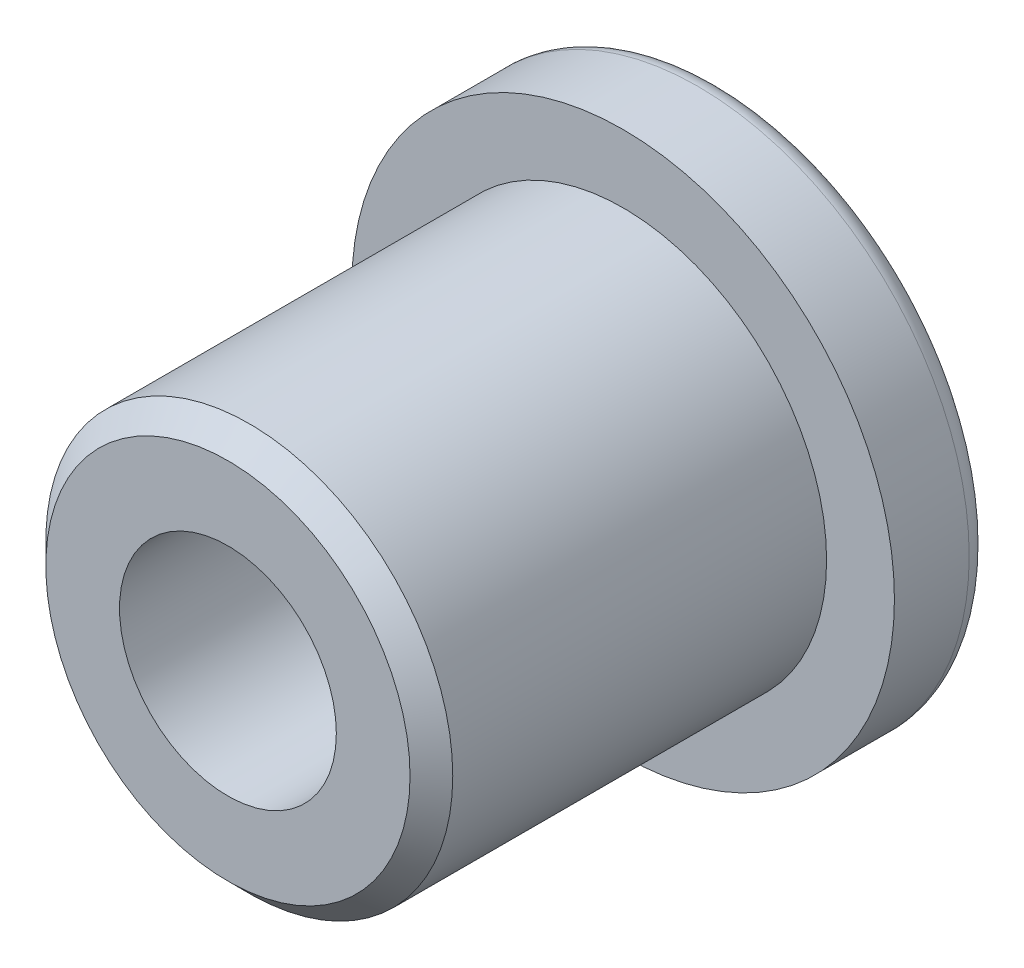
ISO-10303-21;
HEADER;
FILE_DESCRIPTION(('STEP AP214'),'2;1');
FILE_NAME('part.step','',(''),(''),'','','');
FILE_SCHEMA(('AUTOMOTIVE_DESIGN { 1 0 10303 214 1 1 1 1 }'));
ENDSEC;
DATA;
#1=APPLICATION_CONTEXT('core data for automotive mechanical design processes');
#2=APPLICATION_PROTOCOL_DEFINITION('international standard','automotive_design',2000,#1);
#3=PRODUCT_CONTEXT('',#1,'mechanical');
#4=PRODUCT('Part','Part','',(#3));
#5=PRODUCT_RELATED_PRODUCT_CATEGORY('part','',(#4));
#6=PRODUCT_DEFINITION_FORMATION('','',#4);
#7=PRODUCT_DEFINITION_CONTEXT('part definition',#1,'design');
#8=PRODUCT_DEFINITION('design','',#6,#7);
#9=PRODUCT_DEFINITION_SHAPE('','',#8);
#10=(LENGTH_UNIT() NAMED_UNIT(*) SI_UNIT(.MILLI.,.METRE.));
#11=(NAMED_UNIT(*) PLANE_ANGLE_UNIT() SI_UNIT($,.RADIAN.));
#12=(NAMED_UNIT(*) SI_UNIT($,.STERADIAN.) SOLID_ANGLE_UNIT());
#13=UNCERTAINTY_MEASURE_WITH_UNIT(LENGTH_MEASURE(1.E-05),#10,'distance_accuracy_value','');
#14=(GEOMETRIC_REPRESENTATION_CONTEXT(3) GLOBAL_UNCERTAINTY_ASSIGNED_CONTEXT((#13)) GLOBAL_UNIT_ASSIGNED_CONTEXT((#10,
#11,#12)) REPRESENTATION_CONTEXT('',''));
#15=CARTESIAN_POINT('',(0.,0.,0.));
#16=DIRECTION('',(0.,0.,1.));
#17=DIRECTION('',(1.,0.,0.));
#18=AXIS2_PLACEMENT_3D('',#15,#16,#17);
#19=CARTESIAN_POINT('',(0.,0.,3.));
#20=DIRECTION('',(0.,0.,-1.));
#21=DIRECTION('',(-1.,0.,0.));
#22=AXIS2_PLACEMENT_3D('',#19,#20,#21);
#23=CYLINDRICAL_SURFACE('',#22,3.75);
#24=CARTESIAN_POINT('',(0.,0.,10.8));
#25=DIRECTION('',(0.,0.,1.));
#26=DIRECTION('',(1.,0.,0.));
#27=AXIS2_PLACEMENT_3D('',#24,#25,#26);
#28=CIRCLE('',#27,3.75);
#29=CARTESIAN_POINT('',(3.75,0.,10.8));
#30=VERTEX_POINT('',#29);
#31=EDGE_CURVE('E55',#30,#30,#28,.T.);
#32=ORIENTED_EDGE('',*,*,#31,.T.);
#33=EDGE_LOOP('',(#32));
#34=FACE_BOUND('',#33,.T.);
#35=CARTESIAN_POINT('',(0.,0.,7.5));
#36=DIRECTION('',(0.,0.,-1.));
#37=DIRECTION('',(-1.,0.,0.));
#38=AXIS2_PLACEMENT_3D('',#35,#36,#37);
#39=CIRCLE('',#38,3.75);
#40=CARTESIAN_POINT('',(-3.75,0.,7.5));
#41=VERTEX_POINT('',#40);
#42=EDGE_CURVE('E52',#41,#41,#39,.T.);
#43=ORIENTED_EDGE('',*,*,#42,.T.);
#44=EDGE_LOOP('',(#43));
#45=FACE_BOUND('',#44,.T.);
#46=ADVANCED_FACE('F31',(#34,#45),#23,.F.);
#47=CARTESIAN_POINT('',(0.,0.,0.));
#48=DIRECTION('',(0.,0.,1.));
#49=DIRECTION('',(1.,0.,0.));
#50=AXIS2_PLACEMENT_3D('',#47,#48,#49);
#51=PLANE('',#50);
#52=CARTESIAN_POINT('',(0.,0.,0.));
#53=DIRECTION('',(0.,0.,1.));
#54=DIRECTION('',(1.,0.,0.));
#55=AXIS2_PLACEMENT_3D('',#52,#53,#54);
#56=CIRCLE('',#55,6.5);
#57=CARTESIAN_POINT('',(6.5,0.,0.));
#58=VERTEX_POINT('',#57);
#59=EDGE_CURVE('E10',#58,#58,#56,.T.);
#60=ORIENTED_EDGE('',*,*,#59,.T.);
#61=EDGE_LOOP('',(#60));
#62=FACE_BOUND('',#61,.T.);
#63=CARTESIAN_POINT('',(0.,0.,0.));
#64=DIRECTION('',(0.,0.,1.));
#65=DIRECTION('',(1.,0.,0.));
#66=AXIS2_PLACEMENT_3D('',#63,#64,#65);
#67=CIRCLE('',#66,11.7);
#68=CARTESIAN_POINT('',(11.7,0.,0.));
#69=VERTEX_POINT('',#68);
#70=EDGE_CURVE('E58',#69,#69,#67,.F.);
#71=ORIENTED_EDGE('',*,*,#70,.T.);
#72=EDGE_LOOP('',(#71));
#73=FACE_BOUND('',#72,.T.);
#74=ADVANCED_FACE('F100',(#62,#73),#51,.F.);
#75=CARTESIAN_POINT('',(0.,0.,3.));
#76=DIRECTION('',(0.,0.,-1.));
#77=DIRECTION('',(-1.,0.,0.));
#78=AXIS2_PLACEMENT_3D('',#75,#76,#77);
#79=CYLINDRICAL_SURFACE('',#78,12.7);
#80=CARTESIAN_POINT('',(0.,0.,1.));
#81=DIRECTION('',(0.,0.,1.));
#82=DIRECTION('',(1.,0.,0.));
#83=AXIS2_PLACEMENT_3D('',#80,#81,#82);
#84=CIRCLE('',#83,12.7);
#85=CARTESIAN_POINT('',(12.7,0.,1.));
#86=VERTEX_POINT('',#85);
#87=EDGE_CURVE('E61',#86,#86,#84,.T.);
#88=ORIENTED_EDGE('',*,*,#87,.T.);
#89=EDGE_LOOP('',(#88));
#90=FACE_BOUND('',#89,.T.);
#91=CARTESIAN_POINT('',(0.,0.,4.5));
#92=DIRECTION('',(0.,0.,1.));
#93=DIRECTION('',(1.,0.,0.));
#94=AXIS2_PLACEMENT_3D('',#91,#92,#93);
#95=CIRCLE('',#94,12.7);
#96=CARTESIAN_POINT('',(12.7,0.,4.5));
#97=VERTEX_POINT('',#96);
#98=EDGE_CURVE('E73',#97,#97,#95,.T.);
#99=ORIENTED_EDGE('',*,*,#98,.F.);
#100=EDGE_LOOP('',(#99));
#101=FACE_BOUND('',#100,.T.);
#102=ADVANCED_FACE('F105',(#90,#101),#79,.T.);
#103=CARTESIAN_POINT('',(0.,0.,23.));
#104=DIRECTION('',(0.,0.,1.));
#105=DIRECTION('',(1.,0.,0.));
#106=AXIS2_PLACEMENT_3D('',#103,#104,#105);
#107=PLANE('',#106);
#108=CARTESIAN_POINT('',(0.,0.,23.));
#109=DIRECTION('',(0.,0.,1.));
#110=DIRECTION('',(1.,0.,0.));
#111=AXIS2_PLACEMENT_3D('',#108,#109,#110);
#112=CIRCLE('',#111,8.525);
#113=CARTESIAN_POINT('',(8.525,0.,23.));
#114=VERTEX_POINT('',#113);
#115=EDGE_CURVE('E67',#114,#114,#112,.T.);
#116=ORIENTED_EDGE('',*,*,#115,.T.);
#117=EDGE_LOOP('',(#116));
#118=FACE_BOUND('',#117,.T.);
#119=CARTESIAN_POINT('',(0.,0.,23.));
#120=DIRECTION('',(0.,0.,1.));
#121=DIRECTION('',(1.,0.,0.));
#122=AXIS2_PLACEMENT_3D('',#119,#120,#121);
#123=CIRCLE('',#122,5.075);
#124=CARTESIAN_POINT('',(5.075,0.,23.));
#125=VERTEX_POINT('',#124);
#126=EDGE_CURVE('E70',#125,#125,#123,.T.);
#127=ORIENTED_EDGE('',*,*,#126,.F.);
#128=EDGE_LOOP('',(#127));
#129=FACE_BOUND('',#128,.T.);
#130=ADVANCED_FACE('F113',(#118,#129),#107,.T.);
#131=CARTESIAN_POINT('',(0.,0.,23.));
#132=DIRECTION('',(0.,0.,-1.));
#133=DIRECTION('',(-1.,0.,0.));
#134=AXIS2_PLACEMENT_3D('',#131,#132,#133);
#135=CYLINDRICAL_SURFACE('',#134,9.525);
#136=CARTESIAN_POINT('',(0.,0.,4.5));
#137=DIRECTION('',(0.,0.,1.));
#138=DIRECTION('',(1.,0.,0.));
#139=AXIS2_PLACEMENT_3D('',#136,#137,#138);
#140=CIRCLE('',#139,9.525);
#141=CARTESIAN_POINT('',(9.525,0.,4.5));
#142=VERTEX_POINT('',#141);
#143=EDGE_CURVE('E76',#142,#142,#140,.T.);
#144=ORIENTED_EDGE('',*,*,#143,.T.);
#145=EDGE_LOOP('',(#144));
#146=FACE_BOUND('',#145,.T.);
#147=CARTESIAN_POINT('',(0.,0.,22.));
#148=DIRECTION('',(0.,0.,1.));
#149=DIRECTION('',(1.,0.,0.));
#150=AXIS2_PLACEMENT_3D('',#147,#148,#149);
#151=CIRCLE('',#150,9.525);
#152=CARTESIAN_POINT('',(9.525,0.,22.));
#153=VERTEX_POINT('',#152);
#154=EDGE_CURVE('E64',#153,#153,#151,.F.);
#155=ORIENTED_EDGE('',*,*,#154,.T.);
#156=EDGE_LOOP('',(#155));
#157=FACE_BOUND('',#156,.T.);
#158=ADVANCED_FACE('F108',(#146,#157),#135,.T.);
#159=CARTESIAN_POINT('',(0.,0.,23.));
#160=DIRECTION('',(0.,0.,-1.));
#161=DIRECTION('',(-1.,0.,0.));
#162=AXIS2_PLACEMENT_3D('',#159,#160,#161);
#163=CYLINDRICAL_SURFACE('',#162,5.075);
#164=CARTESIAN_POINT('',(0.,0.,10.8));
#165=DIRECTION('',(0.,0.,1.));
#166=DIRECTION('',(1.,0.,0.));
#167=AXIS2_PLACEMENT_3D('',#164,#165,#166);
#168=CIRCLE('',#167,5.075);
#169=CARTESIAN_POINT('',(5.075,0.,10.8));
#170=VERTEX_POINT('',#169);
#171=EDGE_CURVE('E51',#170,#170,#168,.T.);
#172=ORIENTED_EDGE('',*,*,#171,.F.);
#173=EDGE_LOOP('',(#172));
#174=FACE_BOUND('',#173,.T.);
#175=ORIENTED_EDGE('',*,*,#126,.T.);
#176=EDGE_LOOP('',(#175));
#177=FACE_BOUND('',#176,.T.);
#178=ADVANCED_FACE('F118',(#174,#177),#163,.F.);
#179=CARTESIAN_POINT('',(0.,0.,23.));
#180=DIRECTION('',(0.,0.,-1.));
#181=DIRECTION('',(-1.,0.,0.));
#182=AXIS2_PLACEMENT_3D('',#179,#180,#181);
#183=CONICAL_SURFACE('',#182,8.525,0.785398163397447);
#184=ORIENTED_EDGE('',*,*,#154,.F.);
#185=EDGE_LOOP('',(#184));
#186=FACE_BOUND('',#185,.T.);
#187=ORIENTED_EDGE('',*,*,#115,.F.);
#188=EDGE_LOOP('',(#187));
#189=FACE_BOUND('',#188,.T.);
#190=ADVANCED_FACE('F115',(#186,#189),#183,.T.);
#191=CARTESIAN_POINT('',(0.,0.,1.));
#192=DIRECTION('',(0.,0.,1.));
#193=DIRECTION('',(1.,0.,0.));
#194=AXIS2_PLACEMENT_3D('',#191,#192,#193);
#195=TOROIDAL_SURFACE('',#194,11.7,1.);
#196=ORIENTED_EDGE('',*,*,#70,.F.);
#197=EDGE_LOOP('',(#196));
#198=FACE_BOUND('',#197,.T.);
#199=ORIENTED_EDGE('',*,*,#87,.F.);
#200=EDGE_LOOP('',(#199));
#201=FACE_BOUND('',#200,.T.);
#202=ADVANCED_FACE('F96',(#198,#201),#195,.T.);
#203=CARTESIAN_POINT('',(0.,0.,4.5));
#204=DIRECTION('',(0.,0.,1.));
#205=DIRECTION('',(1.,0.,0.));
#206=AXIS2_PLACEMENT_3D('',#203,#204,#205);
#207=PLANE('',#206);
#208=ORIENTED_EDGE('',*,*,#98,.T.);
#209=EDGE_LOOP('',(#208));
#210=FACE_BOUND('',#209,.T.);
#211=ORIENTED_EDGE('',*,*,#143,.F.);
#212=EDGE_LOOP('',(#211));
#213=FACE_BOUND('',#212,.T.);
#214=ADVANCED_FACE('F87',(#210,#213),#207,.T.);
#215=CARTESIAN_POINT('',(0.,0.,10.8));
#216=DIRECTION('',(0.,0.,1.));
#217=DIRECTION('',(1.,0.,0.));
#218=AXIS2_PLACEMENT_3D('',#215,#216,#217);
#219=PLANE('',#218);
#220=ORIENTED_EDGE('',*,*,#171,.T.);
#221=EDGE_LOOP('',(#220));
#222=FACE_BOUND('',#221,.T.);
#223=ORIENTED_EDGE('',*,*,#31,.F.);
#224=EDGE_LOOP('',(#223));
#225=FACE_BOUND('',#224,.T.);
#226=ADVANCED_FACE('F84',(#222,#225),#219,.T.);
#227=CARTESIAN_POINT('',(0.,0.,7.5));
#228=DIRECTION('',(0.,0.,-1.));
#229=DIRECTION('',(-1.,0.,0.));
#230=AXIS2_PLACEMENT_3D('',#227,#228,#229);
#231=CYLINDRICAL_SURFACE('',#230,5.5);
#232=CARTESIAN_POINT('',(0.,0.,6.5));
#233=DIRECTION('',(0.,0.,-1.));
#234=DIRECTION('',(-1.,0.,0.));
#235=AXIS2_PLACEMENT_3D('',#232,#233,#234);
#236=CIRCLE('',#235,5.5);
#237=CARTESIAN_POINT('',(-5.5,0.,6.5));
#238=VERTEX_POINT('',#237);
#239=EDGE_CURVE('E38',#238,#238,#236,.F.);
#240=ORIENTED_EDGE('',*,*,#239,.T.);
#241=EDGE_LOOP('',(#240));
#242=FACE_BOUND('',#241,.T.);
#243=CARTESIAN_POINT('',(0.,0.,1.));
#244=DIRECTION('',(0.,0.,1.));
#245=DIRECTION('',(1.,0.,0.));
#246=AXIS2_PLACEMENT_3D('',#243,#244,#245);
#247=CIRCLE('',#246,5.5);
#248=CARTESIAN_POINT('',(5.5,0.,1.));
#249=VERTEX_POINT('',#248);
#250=EDGE_CURVE('E42',#249,#249,#247,.F.);
#251=ORIENTED_EDGE('',*,*,#250,.T.);
#252=EDGE_LOOP('',(#251));
#253=FACE_BOUND('',#252,.T.);
#254=ADVANCED_FACE('F86',(#242,#253),#231,.F.);
#255=CARTESIAN_POINT('',(0.,0.,7.5));
#256=DIRECTION('',(0.,0.,-1.));
#257=DIRECTION('',(-1.,0.,0.));
#258=AXIS2_PLACEMENT_3D('',#255,#256,#257);
#259=PLANE('',#258);
#260=CARTESIAN_POINT('',(0.,0.,7.5));
#261=DIRECTION('',(0.,0.,-1.));
#262=DIRECTION('',(-1.,0.,0.));
#263=AXIS2_PLACEMENT_3D('',#260,#261,#262);
#264=CIRCLE('',#263,4.49999999999999);
#265=CARTESIAN_POINT('',(-4.49999999999999,0.,7.5));
#266=VERTEX_POINT('',#265);
#267=EDGE_CURVE('E46',#266,#266,#264,.T.);
#268=ORIENTED_EDGE('',*,*,#267,.T.);
#269=EDGE_LOOP('',(#268));
#270=FACE_BOUND('',#269,.T.);
#271=ORIENTED_EDGE('',*,*,#42,.F.);
#272=EDGE_LOOP('',(#271));
#273=FACE_BOUND('',#272,.T.);
#274=ADVANCED_FACE('F94',(#270,#273),#259,.T.);
#275=CARTESIAN_POINT('',(0.,0.,7.5));
#276=DIRECTION('',(0.,0.,-1.));
#277=DIRECTION('',(-1.,0.,0.));
#278=AXIS2_PLACEMENT_3D('',#275,#276,#277);
#279=CONICAL_SURFACE('',#278,4.49999999999999,0.785398163397454);
#280=ORIENTED_EDGE('',*,*,#239,.F.);
#281=EDGE_LOOP('',(#280));
#282=FACE_BOUND('',#281,.T.);
#283=ORIENTED_EDGE('',*,*,#267,.F.);
#284=EDGE_LOOP('',(#283));
#285=FACE_BOUND('',#284,.T.);
#286=ADVANCED_FACE('F122',(#282,#285),#279,.F.);
#287=CARTESIAN_POINT('',(0.,0.,1.));
#288=DIRECTION('',(0.,0.,-1.));
#289=DIRECTION('',(-1.,0.,0.));
#290=AXIS2_PLACEMENT_3D('',#287,#288,#289);
#291=CONICAL_SURFACE('',#290,5.5,0.785398163397449);
#292=ORIENTED_EDGE('',*,*,#59,.F.);
#293=EDGE_LOOP('',(#292));
#294=FACE_BOUND('',#293,.T.);
#295=ORIENTED_EDGE('',*,*,#250,.F.);
#296=EDGE_LOOP('',(#295));
#297=FACE_BOUND('',#296,.T.);
#298=ADVANCED_FACE('F33',(#294,#297),#291,.F.);
#299=CLOSED_SHELL('',(#46,#74,#102,#130,#158,#178,#190,#202,#214,#226,#254,#274,#286,#298));
#300=MANIFOLD_SOLID_BREP('B2',#299);
#301=ADVANCED_BREP_SHAPE_REPRESENTATION('',(#18,#300),#14);
#302=SHAPE_DEFINITION_REPRESENTATION(#9,#301);
ENDSEC;
END-ISO-10303-21;
